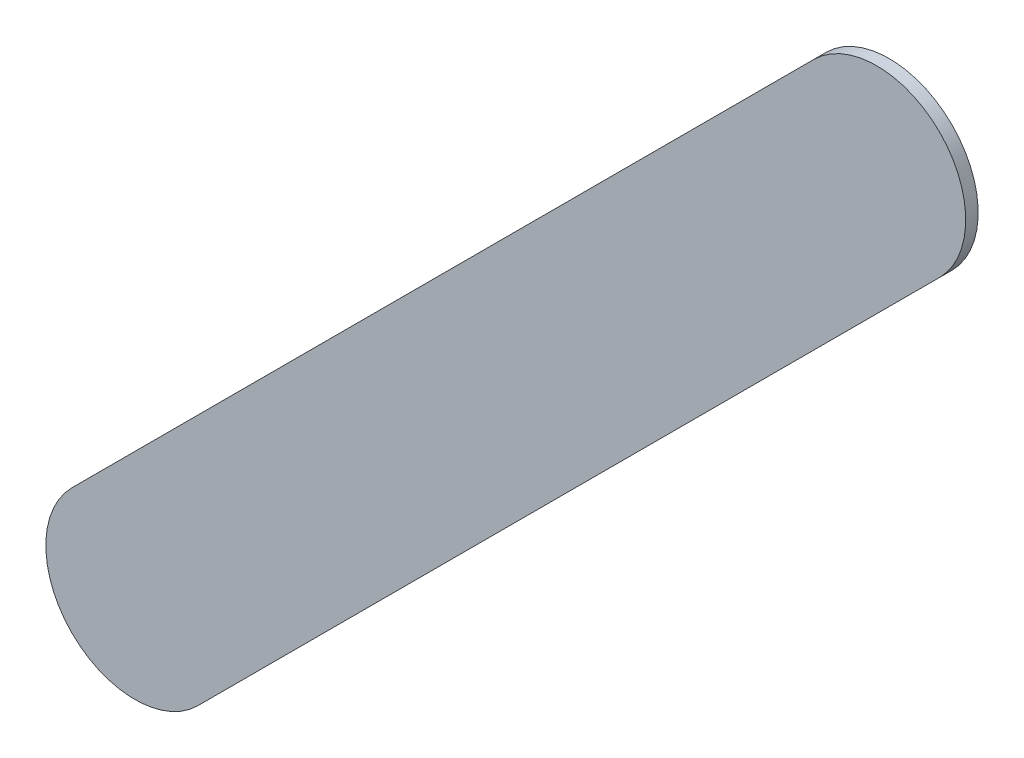
ISO-10303-21;
HEADER;
FILE_DESCRIPTION(('STEP AP214'),'2;1');
FILE_NAME('part.step','',(''),(''),'','','');
FILE_SCHEMA(('AUTOMOTIVE_DESIGN { 1 0 10303 214 1 1 1 1 }'));
ENDSEC;
DATA;
#1=APPLICATION_CONTEXT('core data for automotive mechanical design processes');
#2=APPLICATION_PROTOCOL_DEFINITION('international standard','automotive_design',2000,#1);
#3=PRODUCT_CONTEXT('',#1,'mechanical');
#4=PRODUCT('Part','Part','',(#3));
#5=PRODUCT_RELATED_PRODUCT_CATEGORY('part','',(#4));
#6=PRODUCT_DEFINITION_FORMATION('','',#4);
#7=PRODUCT_DEFINITION_CONTEXT('part definition',#1,'design');
#8=PRODUCT_DEFINITION('design','',#6,#7);
#9=PRODUCT_DEFINITION_SHAPE('','',#8);
#10=(LENGTH_UNIT() NAMED_UNIT(*) SI_UNIT(.MILLI.,.METRE.));
#11=(NAMED_UNIT(*) PLANE_ANGLE_UNIT() SI_UNIT($,.RADIAN.));
#12=(NAMED_UNIT(*) SI_UNIT($,.STERADIAN.) SOLID_ANGLE_UNIT());
#13=UNCERTAINTY_MEASURE_WITH_UNIT(LENGTH_MEASURE(1.E-05),#10,'distance_accuracy_value','');
#14=(GEOMETRIC_REPRESENTATION_CONTEXT(3) GLOBAL_UNCERTAINTY_ASSIGNED_CONTEXT((#13)) GLOBAL_UNIT_ASSIGNED_CONTEXT((#10,
#11,#12)) REPRESENTATION_CONTEXT('',''));
#15=CARTESIAN_POINT('',(0.,0.,0.));
#16=DIRECTION('',(0.,0.,1.));
#17=DIRECTION('',(1.,0.,0.));
#18=AXIS2_PLACEMENT_3D('',#15,#16,#17);
#19=CARTESIAN_POINT('',(104.042776,-101.860776,1.635));
#20=DIRECTION('',(0.,0.,1.));
#21=DIRECTION('',(1.,0.,0.));
#22=AXIS2_PLACEMENT_3D('',#19,#20,#21);
#23=PLANE('',#22);
#24=DIRECTION('',(0.707106781186548,0.707106781186548,0.));
#25=VECTOR('',#24,1.);
#26=CARTESIAN_POINT('',(104.042776,-101.860776,1.635));
#27=LINE('',#26,#25);
#28=CARTESIAN_POINT('',(104.042776,-101.860776,1.635));
#29=VERTEX_POINT('',#28);
#30=CARTESIAN_POINT('',(106.126776,-99.776776,1.635));
#31=VERTEX_POINT('',#30);
#32=EDGE_CURVE('E94',#29,#31,#27,.T.);
#33=ORIENTED_EDGE('',*,*,#32,.T.);
#34=CARTESIAN_POINT('',(105.9499995,-99.5999995,1.635));
#35=DIRECTION('',(0.,0.,1.));
#36=DIRECTION('',(0.707106781186548,-0.707106781186548,0.));
#37=AXIS2_PLACEMENT_3D('',#34,#35,#36);
#38=CIRCLE('',#37,0.249999723809);
#39=CARTESIAN_POINT('',(105.773223,-99.423223,1.635));
#40=VERTEX_POINT('',#39);
#41=EDGE_CURVE('E90',#31,#40,#38,.T.);
#42=ORIENTED_EDGE('',*,*,#41,.T.);
#43=DIRECTION('',(-0.707106781186548,-0.707106781186548,0.));
#44=VECTOR('',#43,1.);
#45=CARTESIAN_POINT('',(105.773223,-99.423223,1.635));
#46=LINE('',#45,#44);
#47=CARTESIAN_POINT('',(103.689223,-101.507223,1.635));
#48=VERTEX_POINT('',#47);
#49=EDGE_CURVE('E109',#40,#48,#46,.T.);
#50=ORIENTED_EDGE('',*,*,#49,.T.);
#51=CARTESIAN_POINT('',(103.8659995,-101.6839995,1.635));
#52=DIRECTION('',(0.,0.,1.));
#53=DIRECTION('',(-0.707106781186548,0.707106781186548,0.));
#54=AXIS2_PLACEMENT_3D('',#51,#52,#53);
#55=CIRCLE('',#54,0.249999723809);
#56=EDGE_CURVE('E11',#48,#29,#55,.T.);
#57=ORIENTED_EDGE('',*,*,#56,.T.);
#58=EDGE_LOOP('',(#33,#42,#50,#57));
#59=FACE_BOUND('',#58,.T.);
#60=ADVANCED_FACE('F17',(#59),#23,.T.);
#61=CARTESIAN_POINT('',(104.042776,-101.860776,1.6));
#62=DIRECTION('',(0.,0.,1.));
#63=DIRECTION('',(1.,0.,0.));
#64=AXIS2_PLACEMENT_3D('',#61,#62,#63);
#65=PLANE('',#64);
#66=CARTESIAN_POINT('',(103.8659995,-101.6839995,1.6));
#67=DIRECTION('',(0.,0.,1.));
#68=DIRECTION('',(-0.707106781186548,0.707106781186548,0.));
#69=AXIS2_PLACEMENT_3D('',#66,#67,#68);
#70=CIRCLE('',#69,0.249999723809);
#71=CARTESIAN_POINT('',(103.689223,-101.507223,1.6));
#72=VERTEX_POINT('',#71);
#73=CARTESIAN_POINT('',(104.042776,-101.860776,1.6));
#74=VERTEX_POINT('',#73);
#75=EDGE_CURVE('E25',#72,#74,#70,.T.);
#76=ORIENTED_EDGE('',*,*,#75,.F.);
#77=DIRECTION('',(-0.707106781186548,-0.707106781186548,0.));
#78=VECTOR('',#77,1.);
#79=CARTESIAN_POINT('',(105.773223,-99.423223,1.6));
#80=LINE('',#79,#78);
#81=CARTESIAN_POINT('',(105.773223,-99.423223,1.6));
#82=VERTEX_POINT('',#81);
#83=EDGE_CURVE('E62',#82,#72,#80,.T.);
#84=ORIENTED_EDGE('',*,*,#83,.F.);
#85=CARTESIAN_POINT('',(105.9499995,-99.5999995,1.6));
#86=DIRECTION('',(0.,0.,1.));
#87=DIRECTION('',(0.707106781186548,-0.707106781186548,0.));
#88=AXIS2_PLACEMENT_3D('',#85,#86,#87);
#89=CIRCLE('',#88,0.249999723809);
#90=CARTESIAN_POINT('',(106.126776,-99.776776,1.6));
#91=VERTEX_POINT('',#90);
#92=EDGE_CURVE('E75',#91,#82,#89,.T.);
#93=ORIENTED_EDGE('',*,*,#92,.F.);
#94=DIRECTION('',(0.707106781186548,0.707106781186548,0.));
#95=VECTOR('',#94,1.);
#96=CARTESIAN_POINT('',(104.042776,-101.860776,1.6));
#97=LINE('',#96,#95);
#98=EDGE_CURVE('E79',#74,#91,#97,.T.);
#99=ORIENTED_EDGE('',*,*,#98,.F.);
#100=EDGE_LOOP('',(#76,#84,#93,#99));
#101=FACE_BOUND('',#100,.T.);
#102=ADVANCED_FACE('F77',(#101),#65,.F.);
#103=CARTESIAN_POINT('',(103.8659995,-101.6839995,1.6));
#104=DIRECTION('',(0.,0.,-1.));
#105=DIRECTION('',(-0.707106781186548,0.707106781186548,0.));
#106=AXIS2_PLACEMENT_3D('',#103,#104,#105);
#107=CYLINDRICAL_SURFACE('',#106,0.249999723809);
#108=ORIENTED_EDGE('',*,*,#75,.T.);
#109=DIRECTION('',(0.,0.,1.));
#110=VECTOR('',#109,1.);
#111=CARTESIAN_POINT('',(104.042776,-101.860776,1.6));
#112=LINE('',#111,#110);
#113=EDGE_CURVE('E84',#74,#29,#112,.T.);
#114=ORIENTED_EDGE('',*,*,#113,.T.);
#115=ORIENTED_EDGE('',*,*,#56,.F.);
#116=DIRECTION('',(0.,0.,1.));
#117=VECTOR('',#116,1.);
#118=CARTESIAN_POINT('',(103.689223,-101.507223,1.6));
#119=LINE('',#118,#117);
#120=EDGE_CURVE('E112',#72,#48,#119,.T.);
#121=ORIENTED_EDGE('',*,*,#120,.F.);
#122=EDGE_LOOP('',(#108,#114,#115,#121));
#123=FACE_BOUND('',#122,.T.);
#124=ADVANCED_FACE('F128',(#123),#107,.T.);
#125=CARTESIAN_POINT('',(105.773223,-99.423223,1.6));
#126=DIRECTION('',(0.707106781186548,-0.707106781186548,0.));
#127=DIRECTION('',(0.,0.,-1.));
#128=AXIS2_PLACEMENT_3D('',#125,#126,#127);
#129=PLANE('',#128);
#130=ORIENTED_EDGE('',*,*,#83,.T.);
#131=ORIENTED_EDGE('',*,*,#120,.T.);
#132=ORIENTED_EDGE('',*,*,#49,.F.);
#133=DIRECTION('',(0.,0.,1.));
#134=VECTOR('',#133,1.);
#135=CARTESIAN_POINT('',(105.773223,-99.423223,1.6));
#136=LINE('',#135,#134);
#137=EDGE_CURVE('E83',#82,#40,#136,.T.);
#138=ORIENTED_EDGE('',*,*,#137,.F.);
#139=EDGE_LOOP('',(#130,#131,#132,#138));
#140=FACE_BOUND('',#139,.T.);
#141=ADVANCED_FACE('F120',(#140),#129,.F.);
#142=CARTESIAN_POINT('',(105.9499995,-99.5999995,1.6));
#143=DIRECTION('',(0.,0.,-1.));
#144=DIRECTION('',(0.707106781186548,-0.707106781186548,0.));
#145=AXIS2_PLACEMENT_3D('',#142,#143,#144);
#146=CYLINDRICAL_SURFACE('',#145,0.249999723809);
#147=ORIENTED_EDGE('',*,*,#92,.T.);
#148=ORIENTED_EDGE('',*,*,#137,.T.);
#149=ORIENTED_EDGE('',*,*,#41,.F.);
#150=DIRECTION('',(0.,0.,1.));
#151=VECTOR('',#150,1.);
#152=CARTESIAN_POINT('',(106.126776,-99.776776,1.6));
#153=LINE('',#152,#151);
#154=EDGE_CURVE('E87',#91,#31,#153,.T.);
#155=ORIENTED_EDGE('',*,*,#154,.F.);
#156=EDGE_LOOP('',(#147,#148,#149,#155));
#157=FACE_BOUND('',#156,.T.);
#158=ADVANCED_FACE('F88',(#157),#146,.T.);
#159=CARTESIAN_POINT('',(104.042776,-101.860776,1.6));
#160=DIRECTION('',(-0.707106781186548,0.707106781186548,0.));
#161=DIRECTION('',(0.,0.,1.));
#162=AXIS2_PLACEMENT_3D('',#159,#160,#161);
#163=PLANE('',#162);
#164=ORIENTED_EDGE('',*,*,#98,.T.);
#165=ORIENTED_EDGE('',*,*,#154,.T.);
#166=ORIENTED_EDGE('',*,*,#32,.F.);
#167=ORIENTED_EDGE('',*,*,#113,.F.);
#168=EDGE_LOOP('',(#164,#165,#166,#167));
#169=FACE_BOUND('',#168,.T.);
#170=ADVANCED_FACE('F96',(#169),#163,.F.);
#171=CLOSED_SHELL('',(#60,#102,#124,#141,#158,#170));
#172=MANIFOLD_SOLID_BREP('B1',#171);
#173=ADVANCED_BREP_SHAPE_REPRESENTATION('',(#18,#172),#14);
#174=SHAPE_DEFINITION_REPRESENTATION(#9,#173);
ENDSEC;
END-ISO-10303-21;
